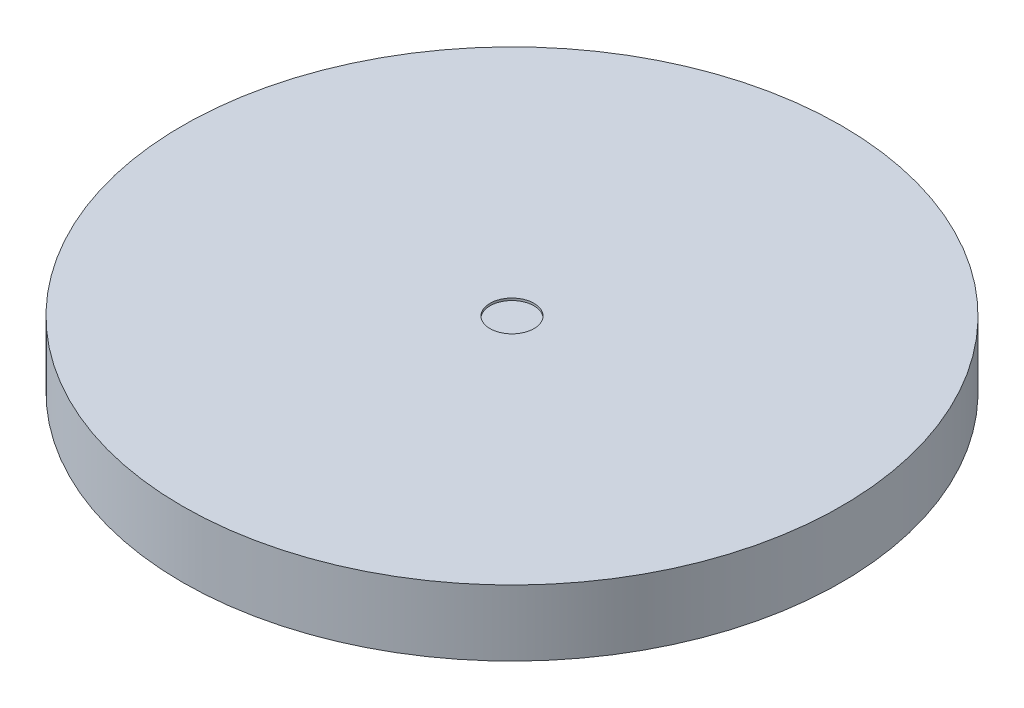
ISO-10303-21;
HEADER;
FILE_DESCRIPTION(('STEP AP214'),'2;1');
FILE_NAME('part.step','',(''),(''),'','','');
FILE_SCHEMA(('AUTOMOTIVE_DESIGN { 1 0 10303 214 1 1 1 1 }'));
ENDSEC;
DATA;
#1=APPLICATION_CONTEXT('core data for automotive mechanical design processes');
#2=APPLICATION_PROTOCOL_DEFINITION('international standard','automotive_design',2000,#1);
#3=PRODUCT_CONTEXT('',#1,'mechanical');
#4=PRODUCT('Part','Part','',(#3));
#5=PRODUCT_RELATED_PRODUCT_CATEGORY('part','',(#4));
#6=PRODUCT_DEFINITION_FORMATION('','',#4);
#7=PRODUCT_DEFINITION_CONTEXT('part definition',#1,'design');
#8=PRODUCT_DEFINITION('design','',#6,#7);
#9=PRODUCT_DEFINITION_SHAPE('','',#8);
#10=(LENGTH_UNIT() NAMED_UNIT(*) SI_UNIT(.MILLI.,.METRE.));
#11=(NAMED_UNIT(*) PLANE_ANGLE_UNIT() SI_UNIT($,.RADIAN.));
#12=(NAMED_UNIT(*) SI_UNIT($,.STERADIAN.) SOLID_ANGLE_UNIT());
#13=UNCERTAINTY_MEASURE_WITH_UNIT(LENGTH_MEASURE(1.E-05),#10,'distance_accuracy_value','');
#14=(GEOMETRIC_REPRESENTATION_CONTEXT(3) GLOBAL_UNCERTAINTY_ASSIGNED_CONTEXT((#13)) GLOBAL_UNIT_ASSIGNED_CONTEXT((#10,
#11,#12)) REPRESENTATION_CONTEXT('',''));
#15=CARTESIAN_POINT('',(0.,0.,0.));
#16=DIRECTION('',(0.,0.,1.));
#17=DIRECTION('',(1.,0.,0.));
#18=AXIS2_PLACEMENT_3D('',#15,#16,#17);
#19=CARTESIAN_POINT('',(0.,6.,0.));
#20=DIRECTION('',(0.,-1.,0.));
#21=DIRECTION('',(0.,0.,-1.));
#22=AXIS2_PLACEMENT_3D('',#19,#20,#21);
#23=CYLINDRICAL_SURFACE('',#22,30.);
#24=CARTESIAN_POINT('',(0.,6.,0.));
#25=DIRECTION('',(0.,1.,0.));
#26=DIRECTION('',(0.,0.,1.));
#27=AXIS2_PLACEMENT_3D('',#24,#25,#26);
#28=CIRCLE('',#27,30.);
#29=CARTESIAN_POINT('',(0.,6.,30.));
#30=VERTEX_POINT('',#29);
#31=EDGE_CURVE('E10',#30,#30,#28,.T.);
#32=ORIENTED_EDGE('',*,*,#31,.F.);
#33=EDGE_LOOP('',(#32));
#34=FACE_BOUND('',#33,.T.);
#35=CARTESIAN_POINT('',(0.,0.,0.));
#36=DIRECTION('',(0.,1.,0.));
#37=DIRECTION('',(0.,0.,1.));
#38=AXIS2_PLACEMENT_3D('',#35,#36,#37);
#39=CIRCLE('',#38,30.);
#40=CARTESIAN_POINT('',(0.,0.,30.));
#41=VERTEX_POINT('',#40);
#42=EDGE_CURVE('E40',#41,#41,#39,.T.);
#43=ORIENTED_EDGE('',*,*,#42,.T.);
#44=EDGE_LOOP('',(#43));
#45=FACE_BOUND('',#44,.T.);
#46=ADVANCED_FACE('F37',(#34,#45),#23,.T.);
#47=CARTESIAN_POINT('',(0.,6.,0.));
#48=DIRECTION('',(0.,1.,0.));
#49=DIRECTION('',(0.,0.,1.));
#50=AXIS2_PLACEMENT_3D('',#47,#48,#49);
#51=PLANE('',#50);
#52=CARTESIAN_POINT('',(0.,6.,0.));
#53=DIRECTION('',(0.,1.,0.));
#54=DIRECTION('',(0.,0.,1.));
#55=AXIS2_PLACEMENT_3D('',#52,#53,#54);
#56=CIRCLE('',#55,2.);
#57=CARTESIAN_POINT('',(0.,6.,2.));
#58=VERTEX_POINT('',#57);
#59=EDGE_CURVE('E51',#58,#58,#56,.T.);
#60=ORIENTED_EDGE('',*,*,#59,.F.);
#61=EDGE_LOOP('',(#60));
#62=FACE_BOUND('',#61,.T.);
#63=ORIENTED_EDGE('',*,*,#31,.T.);
#64=EDGE_LOOP('',(#63));
#65=FACE_BOUND('',#64,.T.);
#66=ADVANCED_FACE('F68',(#62,#65),#51,.T.);
#67=CARTESIAN_POINT('',(0.,0.,0.));
#68=DIRECTION('',(0.,1.,0.));
#69=DIRECTION('',(0.,0.,1.));
#70=AXIS2_PLACEMENT_3D('',#67,#68,#69);
#71=PLANE('',#70);
#72=ORIENTED_EDGE('',*,*,#42,.F.);
#73=EDGE_LOOP('',(#72));
#74=FACE_BOUND('',#73,.T.);
#75=ADVANCED_FACE('F64',(#74),#71,.F.);
#76=CARTESIAN_POINT('',(0.,5.8,0.));
#77=DIRECTION('',(0.,1.,0.));
#78=DIRECTION('',(0.,0.,1.));
#79=AXIS2_PLACEMENT_3D('',#76,#77,#78);
#80=CYLINDRICAL_SURFACE('',#79,2.);
#81=CARTESIAN_POINT('',(0.,5.8,0.));
#82=DIRECTION('',(0.,1.,0.));
#83=DIRECTION('',(0.,0.,1.));
#84=AXIS2_PLACEMENT_3D('',#81,#82,#83);
#85=CIRCLE('',#84,2.);
#86=CARTESIAN_POINT('',(0.,5.8,2.));
#87=VERTEX_POINT('',#86);
#88=EDGE_CURVE('E49',#87,#87,#85,.T.);
#89=ORIENTED_EDGE('',*,*,#88,.F.);
#90=EDGE_LOOP('',(#89));
#91=FACE_BOUND('',#90,.T.);
#92=ORIENTED_EDGE('',*,*,#59,.T.);
#93=EDGE_LOOP('',(#92));
#94=FACE_BOUND('',#93,.T.);
#95=ADVANCED_FACE('F61',(#91,#94),#80,.F.);
#96=CARTESIAN_POINT('',(0.,5.8,0.));
#97=DIRECTION('',(0.,1.,0.));
#98=DIRECTION('',(0.,0.,1.));
#99=AXIS2_PLACEMENT_3D('',#96,#97,#98);
#100=PLANE('',#99);
#101=ORIENTED_EDGE('',*,*,#88,.T.);
#102=EDGE_LOOP('',(#101));
#103=FACE_BOUND('',#102,.T.);
#104=ADVANCED_FACE('F59',(#103),#100,.T.);
#105=CLOSED_SHELL('',(#46,#66,#75,#95,#104));
#106=MANIFOLD_SOLID_BREP('B2',#105);
#107=ADVANCED_BREP_SHAPE_REPRESENTATION('',(#18,#106),#14);
#108=SHAPE_DEFINITION_REPRESENTATION(#9,#107);
ENDSEC;
END-ISO-10303-21;
